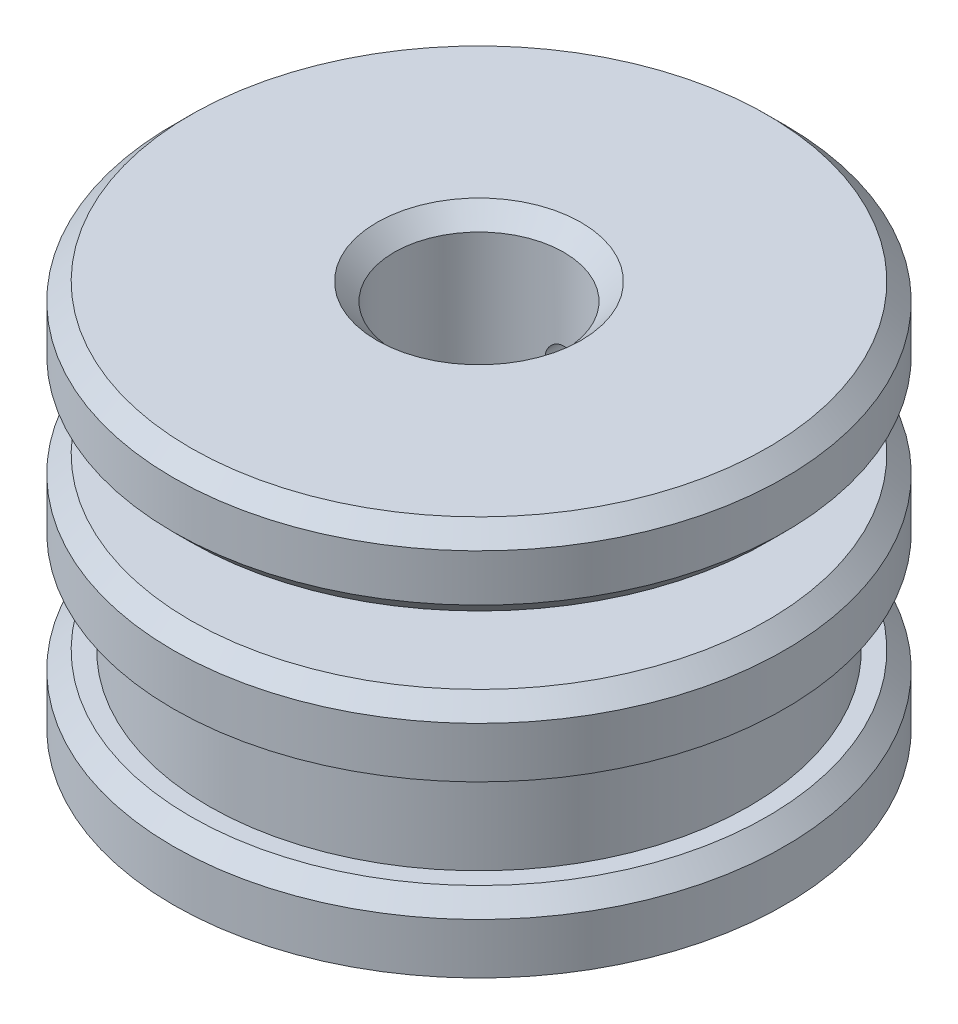
ISO-10303-21;
HEADER;
FILE_DESCRIPTION(('STEP AP214'),'2;1');
FILE_NAME('part.step','',(''),(''),'','','');
FILE_SCHEMA(('AUTOMOTIVE_DESIGN { 1 0 10303 214 1 1 1 1 }'));
ENDSEC;
DATA;
#1=APPLICATION_CONTEXT('core data for automotive mechanical design processes');
#2=APPLICATION_PROTOCOL_DEFINITION('international standard','automotive_design',2000,#1);
#3=PRODUCT_CONTEXT('',#1,'mechanical');
#4=PRODUCT('Part','Part','',(#3));
#5=PRODUCT_RELATED_PRODUCT_CATEGORY('part','',(#4));
#6=PRODUCT_DEFINITION_FORMATION('','',#4);
#7=PRODUCT_DEFINITION_CONTEXT('part definition',#1,'design');
#8=PRODUCT_DEFINITION('design','',#6,#7);
#9=PRODUCT_DEFINITION_SHAPE('','',#8);
#10=(LENGTH_UNIT() NAMED_UNIT(*) SI_UNIT(.MILLI.,.METRE.));
#11=(NAMED_UNIT(*) PLANE_ANGLE_UNIT() SI_UNIT($,.RADIAN.));
#12=(NAMED_UNIT(*) SI_UNIT($,.STERADIAN.) SOLID_ANGLE_UNIT());
#13=UNCERTAINTY_MEASURE_WITH_UNIT(LENGTH_MEASURE(1.E-05),#10,'distance_accuracy_value','');
#14=(GEOMETRIC_REPRESENTATION_CONTEXT(3) GLOBAL_UNCERTAINTY_ASSIGNED_CONTEXT((#13)) GLOBAL_UNIT_ASSIGNED_CONTEXT((#10,
#11,#12)) REPRESENTATION_CONTEXT('',''));
#15=CARTESIAN_POINT('',(0.,0.,0.));
#16=DIRECTION('',(0.,0.,1.));
#17=DIRECTION('',(1.,0.,0.));
#18=AXIS2_PLACEMENT_3D('',#15,#16,#17);
#19=CARTESIAN_POINT('',(0.,7.,0.));
#20=DIRECTION('',(0.,1.,0.));
#21=DIRECTION('',(0.,0.,1.));
#22=AXIS2_PLACEMENT_3D('',#19,#20,#21);
#23=PLANE('',#22);
#24=CARTESIAN_POINT('',(0.,7.,0.));
#25=DIRECTION('',(0.,1.,0.));
#26=DIRECTION('',(0.,0.,1.));
#27=AXIS2_PLACEMENT_3D('',#24,#25,#26);
#28=CIRCLE('',#27,8.492);
#29=CARTESIAN_POINT('',(0.,7.,8.492));
#30=VERTEX_POINT('',#29);
#31=EDGE_CURVE('E227',#30,#30,#28,.T.);
#32=ORIENTED_EDGE('',*,*,#31,.T.);
#33=EDGE_LOOP('',(#32));
#34=FACE_BOUND('',#33,.T.);
#35=CARTESIAN_POINT('',(0.,7.,0.));
#36=DIRECTION('',(0.,1.,0.));
#37=DIRECTION('',(0.,0.,1.));
#38=AXIS2_PLACEMENT_3D('',#35,#36,#37);
#39=CIRCLE('',#38,5.1);
#40=CARTESIAN_POINT('',(0.,7.,5.1));
#41=VERTEX_POINT('',#40);
#42=EDGE_CURVE('E64',#41,#41,#39,.T.);
#43=ORIENTED_EDGE('',*,*,#42,.F.);
#44=EDGE_LOOP('',(#43));
#45=FACE_BOUND('',#44,.T.);
#46=ADVANCED_FACE('F39',(#34,#45),#23,.T.);
#47=CARTESIAN_POINT('',(0.,3.5,0.));
#48=DIRECTION('',(0.,1.,0.));
#49=DIRECTION('',(0.,0.,1.));
#50=AXIS2_PLACEMENT_3D('',#47,#48,#49);
#51=PLANE('',#50);
#52=CARTESIAN_POINT('',(0.,3.5,0.));
#53=DIRECTION('',(0.,1.,0.));
#54=DIRECTION('',(0.,0.,1.));
#55=AXIS2_PLACEMENT_3D('',#52,#53,#54);
#56=CIRCLE('',#55,1.1375);
#57=CARTESIAN_POINT('',(0.,3.5,1.1375));
#58=VERTEX_POINT('',#57);
#59=EDGE_CURVE('E195',#58,#58,#56,.T.);
#60=ORIENTED_EDGE('',*,*,#59,.F.);
#61=EDGE_LOOP('',(#60));
#62=FACE_BOUND('',#61,.T.);
#63=CARTESIAN_POINT('',(0.,3.5,0.));
#64=DIRECTION('',(0.,1.,0.));
#65=DIRECTION('',(0.,0.,1.));
#66=AXIS2_PLACEMENT_3D('',#63,#64,#65);
#67=CIRCLE('',#66,2.5);
#68=CARTESIAN_POINT('',(0.,3.5,-2.5));
#69=VERTEX_POINT('',#68);
#70=EDGE_CURVE('E183',#69,#69,#67,.T.);
#71=ORIENTED_EDGE('',*,*,#70,.T.);
#72=EDGE_LOOP('',(#71));
#73=FACE_BOUND('',#72,.T.);
#74=ADVANCED_FACE('F123',(#62,#73),#51,.T.);
#75=CARTESIAN_POINT('',(0.,2.,0.));
#76=DIRECTION('',(0.,1.,0.));
#77=DIRECTION('',(0.,0.,1.));
#78=AXIS2_PLACEMENT_3D('',#75,#76,#77);
#79=PLANE('',#78);
#80=CARTESIAN_POINT('',(0.,2.,0.));
#81=DIRECTION('',(0.,1.,0.));
#82=DIRECTION('',(0.,0.,1.));
#83=AXIS2_PLACEMENT_3D('',#80,#81,#82);
#84=CIRCLE('',#83,8.492);
#85=CARTESIAN_POINT('',(0.,2.,8.492));
#86=VERTEX_POINT('',#85);
#87=EDGE_CURVE('E82',#86,#86,#84,.T.);
#88=ORIENTED_EDGE('',*,*,#87,.T.);
#89=EDGE_LOOP('',(#88));
#90=FACE_BOUND('',#89,.T.);
#91=CARTESIAN_POINT('',(0.,2.,0.));
#92=DIRECTION('',(0.,1.,0.));
#93=DIRECTION('',(0.,0.,1.));
#94=AXIS2_PLACEMENT_3D('',#91,#92,#93);
#95=CIRCLE('',#94,7.9615);
#96=CARTESIAN_POINT('',(0.,2.,7.9615));
#97=VERTEX_POINT('',#96);
#98=EDGE_CURVE('E203',#97,#97,#95,.T.);
#99=ORIENTED_EDGE('',*,*,#98,.F.);
#100=EDGE_LOOP('',(#99));
#101=FACE_BOUND('',#100,.T.);
#102=ADVANCED_FACE('F119',(#90,#101),#79,.T.);
#103=CARTESIAN_POINT('',(0.,0.,0.));
#104=DIRECTION('',(0.,1.,0.));
#105=DIRECTION('',(0.,0.,1.));
#106=AXIS2_PLACEMENT_3D('',#103,#104,#105);
#107=PLANE('',#106);
#108=CARTESIAN_POINT('',(0.,0.,0.));
#109=DIRECTION('',(0.,1.,0.));
#110=DIRECTION('',(0.,0.,1.));
#111=AXIS2_PLACEMENT_3D('',#108,#109,#110);
#112=CIRCLE('',#111,9.);
#113=CARTESIAN_POINT('',(0.,0.,9.));
#114=VERTEX_POINT('',#113);
#115=EDGE_CURVE('E207',#114,#114,#112,.T.);
#116=ORIENTED_EDGE('',*,*,#115,.F.);
#117=EDGE_LOOP('',(#116));
#118=FACE_BOUND('',#117,.T.);
#119=CARTESIAN_POINT('',(0.,0.,0.));
#120=DIRECTION('',(0.,1.,0.));
#121=DIRECTION('',(0.,0.,1.));
#122=AXIS2_PLACEMENT_3D('',#119,#120,#121);
#123=CIRCLE('',#122,2.35);
#124=CARTESIAN_POINT('',(0.,0.,2.35));
#125=VERTEX_POINT('',#124);
#126=EDGE_CURVE('E211',#125,#125,#123,.T.);
#127=ORIENTED_EDGE('',*,*,#126,.T.);
#128=EDGE_LOOP('',(#127));
#129=FACE_BOUND('',#128,.T.);
#130=ADVANCED_FACE('F122',(#118,#129),#107,.F.);
#131=CARTESIAN_POINT('',(0.,2.,0.));
#132=DIRECTION('',(0.,-1.,0.));
#133=DIRECTION('',(0.,0.,-1.));
#134=AXIS2_PLACEMENT_3D('',#131,#132,#133);
#135=CYLINDRICAL_SURFACE('',#134,9.);
#136=CARTESIAN_POINT('',(0.,1.492,0.));
#137=DIRECTION('',(0.,1.,0.));
#138=DIRECTION('',(0.,0.,1.));
#139=AXIS2_PLACEMENT_3D('',#136,#137,#138);
#140=CIRCLE('',#139,9.);
#141=CARTESIAN_POINT('',(0.,1.492,9.));
#142=VERTEX_POINT('',#141);
#143=EDGE_CURVE('E224',#142,#142,#140,.F.);
#144=ORIENTED_EDGE('',*,*,#143,.T.);
#145=EDGE_LOOP('',(#144));
#146=FACE_BOUND('',#145,.T.);
#147=ORIENTED_EDGE('',*,*,#115,.T.);
#148=EDGE_LOOP('',(#147));
#149=FACE_BOUND('',#148,.T.);
#150=ADVANCED_FACE('F117',(#146,#149),#135,.T.);
#151=CARTESIAN_POINT('',(0.,2.,0.));
#152=DIRECTION('',(0.,-1.,0.));
#153=DIRECTION('',(0.,0.,-1.));
#154=AXIS2_PLACEMENT_3D('',#151,#152,#153);
#155=CYLINDRICAL_SURFACE('',#154,2.35);
#156=CARTESIAN_POINT('',(0.,2.,0.));
#157=DIRECTION('',(0.,1.,0.));
#158=DIRECTION('',(0.,0.,1.));
#159=AXIS2_PLACEMENT_3D('',#156,#157,#158);
#160=CIRCLE('',#159,2.35);
#161=CARTESIAN_POINT('',(0.,2.,2.35));
#162=VERTEX_POINT('',#161);
#163=EDGE_CURVE('E199',#162,#162,#160,.T.);
#164=ORIENTED_EDGE('',*,*,#163,.T.);
#165=EDGE_LOOP('',(#164));
#166=FACE_BOUND('',#165,.T.);
#167=ORIENTED_EDGE('',*,*,#126,.F.);
#168=EDGE_LOOP('',(#167));
#169=FACE_BOUND('',#168,.T.);
#170=ADVANCED_FACE('F114',(#166,#169),#155,.F.);
#171=CARTESIAN_POINT('',(0.,2.,0.));
#172=DIRECTION('',(0.,1.,0.));
#173=DIRECTION('',(0.,0.,1.));
#174=AXIS2_PLACEMENT_3D('',#171,#172,#173);
#175=PLANE('',#174);
#176=ORIENTED_EDGE('',*,*,#163,.F.);
#177=EDGE_LOOP('',(#176));
#178=FACE_BOUND('',#177,.T.);
#179=CARTESIAN_POINT('',(0.,2.,0.));
#180=DIRECTION('',(0.,1.,0.));
#181=DIRECTION('',(0.,0.,1.));
#182=AXIS2_PLACEMENT_3D('',#179,#180,#181);
#183=CIRCLE('',#182,1.1375);
#184=CARTESIAN_POINT('',(0.,2.,1.1375));
#185=VERTEX_POINT('',#184);
#186=EDGE_CURVE('E194',#185,#185,#183,.T.);
#187=ORIENTED_EDGE('',*,*,#186,.T.);
#188=EDGE_LOOP('',(#187));
#189=FACE_BOUND('',#188,.T.);
#190=ADVANCED_FACE('F111',(#178,#189),#175,.F.);
#191=CARTESIAN_POINT('',(0.,3.5,0.));
#192=DIRECTION('',(0.,-1.,0.));
#193=DIRECTION('',(0.,0.,-1.));
#194=AXIS2_PLACEMENT_3D('',#191,#192,#193);
#195=CYLINDRICAL_SURFACE('',#194,7.9615);
#196=CARTESIAN_POINT('',(0.,4.5,-7.9615));
#197=CARTESIAN_POINT('',(-0.0280555522816665,4.49999876566125,-7.96149979131799));
#198=CARTESIAN_POINT('',(-0.0561307420873451,4.49763072306746,-7.96135011654607));
#199=CARTESIAN_POINT('',(-0.111505882549064,4.4882181320296,-7.96076742375952));
#200=CARTESIAN_POINT('',(-0.138804892611196,4.48116814235998,-7.9603340760767));
#201=CARTESIAN_POINT('',(-0.191817547783067,4.46259496482473,-7.9592330600608));
#202=CARTESIAN_POINT('',(-0.21753202164391,4.45107413872632,-7.95856551546257));
#203=CARTESIAN_POINT('',(-0.266655424655623,4.42389015587253,-7.95707118296904));
#204=CARTESIAN_POINT('',(-0.290064879701966,4.40822794700268,-7.95624443152497));
#205=CARTESIAN_POINT('',(-0.33395582006377,4.3731798642851,-7.95452321712793));
#206=CARTESIAN_POINT('',(-0.354433363504546,4.35378905795249,-7.95362866544382));
#207=CARTESIAN_POINT('',(-0.391845487729357,4.31184438186535,-7.95187342902687));
#208=CARTESIAN_POINT('',(-0.408779920373656,4.2892903799214,-7.95101274571132));
#209=CARTESIAN_POINT('',(-0.438637280957019,4.2416371927121,-7.94942162220577));
#210=CARTESIAN_POINT('',(-0.451556931121619,4.21653594987331,-7.94869128864271));
#211=CARTESIAN_POINT('',(-0.472997011695725,4.16451523674249,-7.94744437408186));
#212=CARTESIAN_POINT('',(-0.481517489792777,4.13759578616362,-7.946927790767));
#213=CARTESIAN_POINT('',(-0.493906412432775,4.08274080265692,-7.94616747761722));
#214=CARTESIAN_POINT('',(-0.497781036151258,4.05480667039121,-7.94592338538795));
#215=CARTESIAN_POINT('',(-0.500787338784039,3.99868352104073,-7.94573449546043));
#216=CARTESIAN_POINT('',(-0.499919071854149,3.97049450686994,-7.94578969434479));
#217=CARTESIAN_POINT('',(-0.493469367880923,3.91470388449016,-7.94619282541978));
#218=CARTESIAN_POINT('',(-0.487894618084738,3.88710149978029,-7.94654034226532));
#219=CARTESIAN_POINT('',(-0.472200567623059,3.83322505782507,-7.94748829227245));
#220=CARTESIAN_POINT('',(-0.462081239512402,3.80695100860274,-7.94808872696143));
#221=CARTESIAN_POINT('',(-0.437577692915494,3.75645558133197,-7.9494753255689));
#222=CARTESIAN_POINT('',(-0.423190441331208,3.73223567890446,-7.95026162149293));
#223=CARTESIAN_POINT('',(-0.39056164727838,3.68655219262267,-7.95193120022232));
#224=CARTESIAN_POINT('',(-0.372320061044963,3.66508864007041,-7.95281448412889));
#225=CARTESIAN_POINT('',(-0.332462747600807,3.62548821753974,-7.95458034313697));
#226=CARTESIAN_POINT('',(-0.310841233011267,3.6073571717986,-7.95546291436331));
#227=CARTESIAN_POINT('',(-0.264858106185197,3.57498136350542,-7.95712641833889));
#228=CARTESIAN_POINT('',(-0.240496492982663,3.56073660232347,-7.95790735105231));
#229=CARTESIAN_POINT('',(-0.189721170819998,3.53653821150247,-7.9592796416822));
#230=CARTESIAN_POINT('',(-0.163307356230161,3.52658480291831,-7.95987098983245));
#231=CARTESIAN_POINT('',(-0.109179003120587,3.51125555130128,-7.96079734362871));
#232=CARTESIAN_POINT('',(-0.0814644799425912,3.50587965429136,-7.96113235229741));
#233=CARTESIAN_POINT('',(-0.0255719562845861,3.49986524585095,-7.96150788744323));
#234=CARTESIAN_POINT('',(0.00260517448545931,3.4992186819885,-7.96154891446781));
#235=CARTESIAN_POINT('',(0.0586674914149309,3.50266025300309,-7.96133319463596));
#236=CARTESIAN_POINT('',(0.0865526791077887,3.50674836299866,-7.96107644934436));
#237=CARTESIAN_POINT('',(0.141216863159427,3.51953656774531,-7.96029440983043));
#238=CARTESIAN_POINT('',(0.167996727249672,3.52823296757338,-7.95976933076989));
#239=CARTESIAN_POINT('',(0.219716865036844,3.54998713985105,-7.95850969588825));
#240=CARTESIAN_POINT('',(0.244657122026531,3.56304495190488,-7.95777513816496));
#241=CARTESIAN_POINT('',(0.292026954623742,3.59317178013,-7.95617783415395));
#242=CARTESIAN_POINT('',(0.314453104348506,3.61024617376243,-7.95531491659057));
#243=CARTESIAN_POINT('',(0.356123637306743,3.64791365911845,-7.95355857696868));
#244=CARTESIAN_POINT('',(0.37536798891363,3.66850678581358,-7.95266515460707));
#245=CARTESIAN_POINT('',(0.410155930078497,3.71266191714444,-7.95094705067131));
#246=CARTESIAN_POINT('',(0.425694295173356,3.73622804224868,-7.95012246719309));
#247=CARTESIAN_POINT('',(0.452593447442267,3.78563950625768,-7.94863659262283));
#248=CARTESIAN_POINT('',(0.463954260580229,3.81148483099575,-7.94797530051593));
#249=CARTESIAN_POINT('',(0.482166772462599,3.86470196472342,-7.94689129187827));
#250=CARTESIAN_POINT('',(0.489021758382846,3.89207264505762,-7.94646840145636));
#251=CARTESIAN_POINT('',(0.498038763287107,3.94757921319753,-7.94590840403973));
#252=CARTESIAN_POINT('',(0.500200829387337,3.97571509331788,-7.9457712941758));
#253=CARTESIAN_POINT('',(0.499770165588161,4.0319014365658,-7.94579838944325));
#254=CARTESIAN_POINT('',(0.497185649350214,4.0599519632711,-7.94596207406902));
#255=CARTESIAN_POINT('',(0.487352215977729,4.11521992869653,-7.94657121023866));
#256=CARTESIAN_POINT('',(0.48010329040541,4.14243736590953,-7.94701666229224));
#257=CARTESIAN_POINT('',(0.461148659220582,4.19526778259293,-7.94813900751278));
#258=CARTESIAN_POINT('',(0.449442987719071,4.22088077434168,-7.94881589890835));
#259=CARTESIAN_POINT('',(0.42190827564331,4.26977896095069,-7.9503248318725));
#260=CARTESIAN_POINT('',(0.406079341346107,4.29306421578694,-7.95115686944203));
#261=CARTESIAN_POINT('',(0.370717064129016,4.3366875977128,-7.95288401149174));
#262=CARTESIAN_POINT('',(0.351177782415466,4.35702090655992,-7.95377921561284));
#263=CARTESIAN_POINT('',(0.308957451331552,4.39412586548483,-7.95553096656393));
#264=CARTESIAN_POINT('',(0.286275634553522,4.41089664304996,-7.95638750388352));
#265=CARTESIAN_POINT('',(0.238388042544736,4.44041295280263,-7.95796630096387));
#266=CARTESIAN_POINT('',(0.213179160569494,4.45315344826736,-7.95868839224498));
#267=CARTESIAN_POINT('',(0.160993877205899,4.47420545792264,-7.95991467286644));
#268=CARTESIAN_POINT('',(0.134019587221334,4.48252215800914,-7.96041911721676));
#269=CARTESIAN_POINT('',(0.0890669554035234,4.49232947252741,-7.96102110736195));
#270=CARTESIAN_POINT('',(0.0713791656914486,4.49520219953696,-7.96119989374308));
#271=CARTESIAN_POINT('',(0.0357969158030593,4.49903785575929,-7.96143940656038));
#272=CARTESIAN_POINT('',(0.0179024559155674,4.50000078764071,-7.96150013316154));
#273=CARTESIAN_POINT('',(0.,4.5,-7.9615));
#274=B_SPLINE_CURVE_WITH_KNOTS('',3,(#196,#197,#198,#199,#200,#201,#202,#203,#204,#205,#206,
#207,#208,#209,#210,#211,#212,#213,#214,#215,#216,#217,#218,#219,#220,#221,#222,#223,#224,#225,
#226,#227,#228,#229,#230,#231,#232,#233,#234,#235,#236,#237,#238,#239,#240,#241,#242,#243,#244,
#245,#246,#247,#248,#249,#250,#251,#252,#253,#254,#255,#256,#257,#258,#259,#260,#261,#262,#263,
#264,#265,#266,#267,#268,#269,#270,#271,#272,#273),.UNSPECIFIED.,.T.,.F.,(4,2,2,2,2,2,2,2,2,2,2,
2,2,2,2,2,2,2,2,2,2,2,2,2,2,2,2,2,2,2,2,2,2,2,2,2,2,2,4),(0.,0.0841013021374013,
0.168300515856559,0.252455310854731,0.336590861032201,0.420838487792085,0.505089636295716,
0.589409390034468,0.673728229717928,0.757934797067744,0.842140402922581,0.926226565477785,
1.01031323584457,1.09445980808805,1.1786073358433,1.262900558528,1.34719381092983,
1.43149140490253,1.51578800484243,1.59994104310795,1.68409363913746,1.76817886355132,
1.85226485152992,1.9364640623364,2.02066411001982,2.10498216508614,2.18929969609829,
2.27355564572423,2.35781074942908,2.44192019234253,2.52602978740794,2.61013873872909,
2.69424552235752,2.77848807994574,2.86275124596161,2.94711930505771,3.03138824256247,
3.08505398197475,3.13871964639799),.UNSPECIFIED.);
#275=CARTESIAN_POINT('',(0.,4.5,-7.9615));
#276=VERTEX_POINT('',#275);
#277=EDGE_CURVE('E58',#276,#276,#274,.T.);
#278=ORIENTED_EDGE('',*,*,#277,.T.);
#279=EDGE_LOOP('',(#278));
#280=FACE_BOUND('',#279,.T.);
#281=ORIENTED_EDGE('',*,*,#98,.T.);
#282=EDGE_LOOP('',(#281));
#283=FACE_BOUND('',#282,.T.);
#284=CARTESIAN_POINT('',(0.,5.,0.));
#285=DIRECTION('',(0.,1.,0.));
#286=DIRECTION('',(0.,0.,1.));
#287=AXIS2_PLACEMENT_3D('',#284,#285,#286);
#288=CIRCLE('',#287,7.9615);
#289=CARTESIAN_POINT('',(0.,5.,7.9615));
#290=VERTEX_POINT('',#289);
#291=EDGE_CURVE('E187',#290,#290,#288,.T.);
#292=ORIENTED_EDGE('',*,*,#291,.F.);
#293=EDGE_LOOP('',(#292));
#294=FACE_BOUND('',#293,.T.);
#295=ADVANCED_FACE('F105',(#280,#283,#294),#195,.T.);
#296=CARTESIAN_POINT('',(0.,3.5,0.));
#297=DIRECTION('',(0.,-1.,0.));
#298=DIRECTION('',(0.,0.,-1.));
#299=AXIS2_PLACEMENT_3D('',#296,#297,#298);
#300=CYLINDRICAL_SURFACE('',#299,1.1375);
#301=ORIENTED_EDGE('',*,*,#59,.T.);
#302=EDGE_LOOP('',(#301));
#303=FACE_BOUND('',#302,.T.);
#304=ORIENTED_EDGE('',*,*,#186,.F.);
#305=EDGE_LOOP('',(#304));
#306=FACE_BOUND('',#305,.T.);
#307=ADVANCED_FACE('F110',(#303,#306),#300,.F.);
#308=CARTESIAN_POINT('',(0.,5.,0.));
#309=DIRECTION('',(0.,-1.,0.));
#310=DIRECTION('',(0.,0.,-1.));
#311=AXIS2_PLACEMENT_3D('',#308,#309,#310);
#312=CYLINDRICAL_SURFACE('',#311,2.5);
#313=CARTESIAN_POINT('',(0.,10.892,0.));
#314=DIRECTION('',(0.,1.,0.));
#315=DIRECTION('',(0.,0.,1.));
#316=AXIS2_PLACEMENT_3D('',#313,#314,#315);
#317=CIRCLE('',#316,2.5);
#318=CARTESIAN_POINT('',(0.,10.892,2.5));
#319=VERTEX_POINT('',#318);
#320=EDGE_CURVE('E11',#319,#319,#317,.T.);
#321=ORIENTED_EDGE('',*,*,#320,.T.);
#322=EDGE_LOOP('',(#321));
#323=FACE_BOUND('',#322,.T.);
#324=CARTESIAN_POINT('',(0.,8.5,-2.5));
#325=CARTESIAN_POINT('',(-0.0277884533963166,8.49999897775083,-2.49999948790436));
#326=CARTESIAN_POINT('',(-0.0555898301007612,8.49767557851618,-2.49953192589115));
#327=CARTESIAN_POINT('',(-0.11040675384451,8.48845074994238,-2.49771182811616));
#328=CARTESIAN_POINT('',(-0.137421658770678,8.48154568359925,-2.49635858930093));
#329=CARTESIAN_POINT('',(-0.189865152631656,8.4633793631896,-2.49291824639143));
#330=CARTESIAN_POINT('',(-0.215295233966567,8.45212228157766,-2.49083184538359));
#331=CARTESIAN_POINT('',(-0.263903994432113,8.42558387624435,-2.48615199017657));
#332=CARTESIAN_POINT('',(-0.287082807537906,8.4103027921964,-2.48355856617854));
#333=CARTESIAN_POINT('',(-0.330846738657433,8.37593075285428,-2.47811082664985));
#334=CARTESIAN_POINT('',(-0.351396975579263,8.3567958223044,-2.47525372752174));
#335=CARTESIAN_POINT('',(-0.389018378304015,8.31535379180415,-2.46962090226294));
#336=CARTESIAN_POINT('',(-0.406089272385213,8.29304644433244,-2.46684518250212));
#337=CARTESIAN_POINT('',(-0.436415876673811,8.24564190349406,-2.46166220906308));
#338=CARTESIAN_POINT('',(-0.449635469432934,8.22052117810182,-2.45925853682473));
#339=CARTESIAN_POINT('',(-0.471652833290155,8.16835909049796,-2.45513134029209));
#340=CARTESIAN_POINT('',(-0.48045104121862,8.14131791832683,-2.45340774880981));
#341=CARTESIAN_POINT('',(-0.493262649942414,8.08645781804604,-2.45086402626102));
#342=CARTESIAN_POINT('',(-0.497337248979389,8.05865372792889,-2.45003235053594));
#343=CARTESIAN_POINT('',(-0.50077606386306,8.00274508931783,-2.44933187530314));
#344=CARTESIAN_POINT('',(-0.500140761356751,7.97464057183993,-2.4494629773392));
#345=CARTESIAN_POINT('',(-0.49422728655091,7.9193766059895,-2.45066275574092));
#346=CARTESIAN_POINT('',(-0.489019270121953,7.89220929718634,-2.45171726429382));
#347=CARTESIAN_POINT('',(-0.474218942311526,7.8391419616685,-2.45462273080001));
#348=CARTESIAN_POINT('',(-0.464626421550341,7.8132419955405,-2.45647372678889));
#349=CARTESIAN_POINT('',(-0.44126239183736,7.7632423691482,-2.46077809250204));
#350=CARTESIAN_POINT('',(-0.427463075616058,7.73915606021541,-2.46323544906852));
#351=CARTESIAN_POINT('',(-0.39609678728634,7.69361457501359,-2.46847309386531));
#352=CARTESIAN_POINT('',(-0.378529382178415,7.67215970157442,-2.47125341919183));
#353=CARTESIAN_POINT('',(-0.339749967280292,7.63208529877153,-2.47688510620731));
#354=CARTESIAN_POINT('',(-0.318478080606222,7.61352371607043,-2.47973684605452));
#355=CARTESIAN_POINT('',(-0.273092512031005,7.58022307684939,-2.48514424357204));
#356=CARTESIAN_POINT('',(-0.248978793689695,7.56548406935321,-2.48769989744487));
#357=CARTESIAN_POINT('',(-0.198529693439461,7.54023624538701,-2.49223345080444));
#358=CARTESIAN_POINT('',(-0.17219090979265,7.52973405317773,-2.49421044424136));
#359=CARTESIAN_POINT('',(-0.118074488224332,7.51331976298072,-2.49735704493929));
#360=CARTESIAN_POINT('',(-0.0902970250362247,7.50740710896319,-2.49852675000266));
#361=CARTESIAN_POINT('',(-0.034589702813575,7.50042177310286,-2.49991335933434));
#362=CARTESIAN_POINT('',(-0.00667016416278788,7.49926979022987,-2.50014587326235));
#363=CARTESIAN_POINT('',(0.0489624670963572,7.50162492947109,-2.49967525965051));
#364=CARTESIAN_POINT('',(0.0766755712218968,7.5051317896763,-2.49897218470723));
#365=CARTESIAN_POINT('',(0.130852829973271,7.51663918677198,-2.49671916004009));
#366=CARTESIAN_POINT('',(0.157325974169952,7.52459903424895,-2.49517688202103));
#367=CARTESIAN_POINT('',(0.208561813749834,7.5447419913279,-2.49141776030516));
#368=CARTESIAN_POINT('',(0.23332438081877,7.55692541733842,-2.48920086607113));
#369=CARTESIAN_POINT('',(0.280770586843109,7.58534124532566,-2.48429955766647));
#370=CARTESIAN_POINT('',(0.303425063376095,7.60162139051947,-2.48160975218526));
#371=CARTESIAN_POINT('',(0.345709009559604,7.63770459560364,-2.47607367414941));
#372=CARTESIAN_POINT('',(0.365338154465382,7.65750803319993,-2.47322738484194));
#373=CARTESIAN_POINT('',(0.401320295387089,7.70043667594556,-2.46764651778482));
#374=CARTESIAN_POINT('',(0.417618851224329,7.72360787211067,-2.46491430116652));
#375=CARTESIAN_POINT('',(0.446092710025604,7.77240568067834,-2.45992095898097));
#376=CARTESIAN_POINT('',(0.458268177961452,7.79803219478678,-2.45765981456671));
#377=CARTESIAN_POINT('',(0.478075920790981,7.85088412307478,-2.45388370292191));
#378=CARTESIAN_POINT('',(0.485731749895526,7.87810042060516,-2.45236487436093));
#379=CARTESIAN_POINT('',(0.496354325813599,7.93346672674545,-2.45023718396013));
#380=CARTESIAN_POINT('',(0.499321684112557,7.96161661310468,-2.44962820345556));
#381=CARTESIAN_POINT('',(0.500460455433734,8.01750443227216,-2.4493957481569));
#382=CARTESIAN_POINT('',(0.498717894035448,8.04524057446351,-2.4497545959465));
#383=CARTESIAN_POINT('',(0.49067615205003,8.10001582495252,-2.45137786742307));
#384=CARTESIAN_POINT('',(0.484377008064649,8.1270549388474,-2.45264228383585));
#385=CARTESIAN_POINT('',(0.467439284249477,8.17961385562027,-2.45592632109579));
#386=CARTESIAN_POINT('',(0.456811253358672,8.20513718025121,-2.45794410509415));
#387=CARTESIAN_POINT('',(0.431527322300801,8.25405186036722,-2.46250857487085));
#388=CARTESIAN_POINT('',(0.416871084387441,8.27744303686257,-2.46505530499447));
#389=CARTESIAN_POINT('',(0.383652957393207,8.32185778607516,-2.47044480261613));
#390=CARTESIAN_POINT('',(0.36502894361759,8.3428343826338,-2.4732918645485));
#391=CARTESIAN_POINT('',(0.32453218450657,8.38139310276459,-2.47893040935977));
#392=CARTESIAN_POINT('',(0.302658693576667,8.39897444515864,-2.48172187931592));
#393=CARTESIAN_POINT('',(0.256008814544123,8.43041732197323,-2.48696916193986));
#394=CARTESIAN_POINT('',(0.231204442214917,8.44423800164001,-2.48942115609623));
#395=CARTESIAN_POINT('',(0.179583180470366,8.4674930612983,-2.493675625425));
#396=CARTESIAN_POINT('',(0.152768130431563,8.47693139476625,-2.49547868569308));
#397=CARTESIAN_POINT('',(0.10491074446189,8.48932597402236,-2.49788186297685));
#398=CARTESIAN_POINT('',(0.0841408320068922,8.49332159685388,-2.49867151579226));
#399=CARTESIAN_POINT('',(0.0422497626050334,8.49865895617918,-2.49973077069946));
#400=CARTESIAN_POINT('',(0.0211286168743095,8.50000077725488,-2.50000038936577));
#401=CARTESIAN_POINT('',(0.,8.5,-2.5));
#402=B_SPLINE_CURVE_WITH_KNOTS('',3,(#324,#325,#326,#327,#328,#329,#330,#331,#332,#333,#334,
#335,#336,#337,#338,#339,#340,#341,#342,#343,#344,#345,#346,#347,#348,#349,#350,#351,#352,#353,
#354,#355,#356,#357,#358,#359,#360,#361,#362,#363,#364,#365,#366,#367,#368,#369,#370,#371,#372,
#373,#374,#375,#376,#377,#378,#379,#380,#381,#382,#383,#384,#385,#386,#387,#388,#389,#390,#391,
#392,#393,#394,#395,#396,#397,#398,#399,#400,#401),.UNSPECIFIED.,.T.,.F.,(4,2,2,2,2,2,2,2,2,2,2,
2,2,2,2,2,2,2,2,2,2,2,2,2,2,2,2,2,2,2,2,2,2,2,2,2,2,2,4),(0.,0.0832880653306292,
0.166642325345662,0.249916867625171,0.333186451115432,0.417466335056093,0.501752798373684,
0.586805975029615,0.671850746825989,0.755780925517938,0.839702521406128,0.922358635031393,
1.00501869626865,1.08823745101796,1.17146577374835,1.25619126245676,1.3409178376991,
1.42577637427012,1.51062462849018,1.59405367838133,1.67747803828934,1.76015226975362,
1.84283269608011,1.9265253301668,2.01022694172965,2.09520314289613,2.18017594361734,
2.26470190516362,2.34921684165208,2.43219861283851,2.51517971746305,2.59795980626556,
2.68074683790934,2.76494038119572,2.84915327266466,2.93424748337819,3.0192647775876,
3.08259387644947,3.14592095685498),.UNSPECIFIED.);
#403=CARTESIAN_POINT('',(0.,8.5,-2.5));
#404=VERTEX_POINT('',#403);
#405=EDGE_CURVE('E59',#404,#404,#402,.T.);
#406=ORIENTED_EDGE('',*,*,#405,.F.);
#407=EDGE_LOOP('',(#406));
#408=FACE_BOUND('',#407,.T.);
#409=ORIENTED_EDGE('',*,*,#70,.F.);
#410=CARTESIAN_POINT('',(0.,4.5,-2.5));
#411=CARTESIAN_POINT('',(-0.0277884533963166,4.49999897775083,-2.49999948790436));
#412=CARTESIAN_POINT('',(-0.0555898301007611,4.49767557851618,-2.49953192589115));
#413=CARTESIAN_POINT('',(-0.11040675384451,4.48845074994238,-2.49771182811616));
#414=CARTESIAN_POINT('',(-0.137421658770678,4.48154568359925,-2.49635858930093));
#415=CARTESIAN_POINT('',(-0.189865152631657,4.46337936318961,-2.49291824639143));
#416=CARTESIAN_POINT('',(-0.215295233966567,4.45212228157766,-2.49083184538359));
#417=CARTESIAN_POINT('',(-0.263903994432113,4.42558387624435,-2.48615199017657));
#418=CARTESIAN_POINT('',(-0.287082807537906,4.4103027921964,-2.48355856617854));
#419=CARTESIAN_POINT('',(-0.330846738657432,4.37593075285428,-2.47811082664985));
#420=CARTESIAN_POINT('',(-0.351396975579262,4.3567958223044,-2.47525372752174));
#421=CARTESIAN_POINT('',(-0.389018378304014,4.31535379180415,-2.46962090226294));
#422=CARTESIAN_POINT('',(-0.406089272385212,4.29304644433244,-2.46684518250212));
#423=CARTESIAN_POINT('',(-0.43641587667381,4.24564190349406,-2.46166220906308));
#424=CARTESIAN_POINT('',(-0.449635469432933,4.22052117810182,-2.45925853682473));
#425=CARTESIAN_POINT('',(-0.471652833290154,4.16835909049796,-2.45513134029209));
#426=CARTESIAN_POINT('',(-0.480451041218619,4.14131791832683,-2.45340774880981));
#427=CARTESIAN_POINT('',(-0.493262649942414,4.08645781804604,-2.45086402626102));
#428=CARTESIAN_POINT('',(-0.497337248979389,4.05865372792889,-2.45003235053594));
#429=CARTESIAN_POINT('',(-0.50077606386306,4.00274508931783,-2.44933187530314));
#430=CARTESIAN_POINT('',(-0.50014076135675,3.97464057183993,-2.4494629773392));
#431=CARTESIAN_POINT('',(-0.494227286550909,3.9193766059895,-2.45066275574092));
#432=CARTESIAN_POINT('',(-0.489019270121953,3.89220929718634,-2.45171726429382));
#433=CARTESIAN_POINT('',(-0.474218942311525,3.8391419616685,-2.45462273080001));
#434=CARTESIAN_POINT('',(-0.46462642155034,3.8132419955405,-2.45647372678889));
#435=CARTESIAN_POINT('',(-0.44126239183736,3.7632423691482,-2.46077809250204));
#436=CARTESIAN_POINT('',(-0.427463075616057,3.73915606021541,-2.46323544906852));
#437=CARTESIAN_POINT('',(-0.396096787286339,3.69361457501359,-2.46847309386531));
#438=CARTESIAN_POINT('',(-0.378529382178414,3.67215970157442,-2.47125341919183));
#439=CARTESIAN_POINT('',(-0.339749967280292,3.63208529877153,-2.47688510620731));
#440=CARTESIAN_POINT('',(-0.318478080606222,3.61352371607043,-2.47973684605452));
#441=CARTESIAN_POINT('',(-0.273092512031005,3.58022307684939,-2.48514424357204));
#442=CARTESIAN_POINT('',(-0.248978793689694,3.56548406935321,-2.48769989744487));
#443=CARTESIAN_POINT('',(-0.19852969343946,3.54023624538701,-2.49223345080444));
#444=CARTESIAN_POINT('',(-0.17219090979265,3.52973405317773,-2.49421044424136));
#445=CARTESIAN_POINT('',(-0.118074488224332,3.51331976298072,-2.49735704493929));
#446=CARTESIAN_POINT('',(-0.0902970250362245,3.50740710896319,-2.49852675000266));
#447=CARTESIAN_POINT('',(-0.0345897028135748,3.50042177310286,-2.49991335933434));
#448=CARTESIAN_POINT('',(-0.00667016416278772,3.49926979022987,-2.50014587326235));
#449=CARTESIAN_POINT('',(0.0489624670963573,3.50162492947109,-2.49967525965051));
#450=CARTESIAN_POINT('',(0.0766755712218968,3.5051317896763,-2.49897218470723));
#451=CARTESIAN_POINT('',(0.130852829973271,3.51663918677198,-2.49671916004009));
#452=CARTESIAN_POINT('',(0.157325974169952,3.52459903424895,-2.49517688202103));
#453=CARTESIAN_POINT('',(0.208561813749834,3.5447419913279,-2.49141776030516));
#454=CARTESIAN_POINT('',(0.23332438081877,3.55692541733842,-2.48920086607113));
#455=CARTESIAN_POINT('',(0.280770586843109,3.58534124532566,-2.48429955766647));
#456=CARTESIAN_POINT('',(0.303425063376094,3.60162139051947,-2.48160975218526));
#457=CARTESIAN_POINT('',(0.345709009559603,3.63770459560364,-2.47607367414941));
#458=CARTESIAN_POINT('',(0.365338154465381,3.65750803319993,-2.47322738484194));
#459=CARTESIAN_POINT('',(0.401320295387088,3.70043667594556,-2.46764651778483));
#460=CARTESIAN_POINT('',(0.417618851224327,3.72360787211067,-2.46491430116652));
#461=CARTESIAN_POINT('',(0.446092710025603,3.77240568067834,-2.45992095898097));
#462=CARTESIAN_POINT('',(0.458268177961451,3.79803219478678,-2.45765981456671));
#463=CARTESIAN_POINT('',(0.47807592079098,3.85088412307477,-2.45388370292191));
#464=CARTESIAN_POINT('',(0.485731749895525,3.87810042060516,-2.45236487436093));
#465=CARTESIAN_POINT('',(0.496354325813598,3.93346672674545,-2.45023718396013));
#466=CARTESIAN_POINT('',(0.499321684112556,3.96161661310467,-2.44962820345556));
#467=CARTESIAN_POINT('',(0.500460455433734,4.01750443227216,-2.4493957481569));
#468=CARTESIAN_POINT('',(0.498717894035448,4.0452405744635,-2.4497545959465));
#469=CARTESIAN_POINT('',(0.490676152050031,4.10001582495251,-2.45137786742307));
#470=CARTESIAN_POINT('',(0.484377008064649,4.1270549388474,-2.45264228383585));
#471=CARTESIAN_POINT('',(0.467439284249477,4.17961385562027,-2.45592632109579));
#472=CARTESIAN_POINT('',(0.456811253358672,4.20513718025121,-2.45794410509415));
#473=CARTESIAN_POINT('',(0.431527322300802,4.25405186036722,-2.46250857487085));
#474=CARTESIAN_POINT('',(0.416871084387441,4.27744303686257,-2.46505530499447));
#475=CARTESIAN_POINT('',(0.383652957393207,4.32185778607516,-2.47044480261613));
#476=CARTESIAN_POINT('',(0.36502894361759,4.3428343826338,-2.4732918645485));
#477=CARTESIAN_POINT('',(0.324532184506571,4.38139310276459,-2.47893040935977));
#478=CARTESIAN_POINT('',(0.302658693576668,4.39897444515864,-2.48172187931592));
#479=CARTESIAN_POINT('',(0.256008814544123,4.43041732197322,-2.48696916193986));
#480=CARTESIAN_POINT('',(0.231204442214918,4.44423800164001,-2.48942115609623));
#481=CARTESIAN_POINT('',(0.179583180470367,4.4674930612983,-2.493675625425));
#482=CARTESIAN_POINT('',(0.152768130431563,4.47693139476625,-2.49547868569308));
#483=CARTESIAN_POINT('',(0.10491074446189,4.48932597402236,-2.49788186297685));
#484=CARTESIAN_POINT('',(0.0841408320068926,4.49332159685388,-2.49867151579226));
#485=CARTESIAN_POINT('',(0.0422497626050337,4.49865895617918,-2.49973077069946));
#486=CARTESIAN_POINT('',(0.0211286168743096,4.50000077725488,-2.50000038936577));
#487=CARTESIAN_POINT('',(0.,4.5,-2.5));
#488=B_SPLINE_CURVE_WITH_KNOTS('',3,(#410,#411,#412,#413,#414,#415,#416,#417,#418,#419,#420,
#421,#422,#423,#424,#425,#426,#427,#428,#429,#430,#431,#432,#433,#434,#435,#436,#437,#438,#439,
#440,#441,#442,#443,#444,#445,#446,#447,#448,#449,#450,#451,#452,#453,#454,#455,#456,#457,#458,
#459,#460,#461,#462,#463,#464,#465,#466,#467,#468,#469,#470,#471,#472,#473,#474,#475,#476,#477,
#478,#479,#480,#481,#482,#483,#484,#485,#486,#487),.UNSPECIFIED.,.T.,.F.,(4,2,2,2,2,2,2,2,2,2,2,
2,2,2,2,2,2,2,2,2,2,2,2,2,2,2,2,2,2,2,2,2,2,2,2,2,2,2,4),(0.,0.0832880653306292,
0.166642325345662,0.249916867625171,0.333186451115432,0.417466335056093,0.501752798373683,
0.586805975029613,0.671850746825988,0.755780925517937,0.839702521406126,0.922358635031392,
1.00501869626865,1.08823745101796,1.17146577374835,1.25619126245675,1.3409178376991,
1.42577637427012,1.51062462849018,1.59405367838133,1.67747803828934,1.76015226975362,
1.84283269608011,1.92652533016679,2.01022694172965,2.09520314289613,2.18017594361733,
2.26470190516362,2.34921684165207,2.43219861283851,2.51517971746304,2.59795980626555,
2.68074683790933,2.76494038119572,2.84915327266465,2.93424748337819,3.01926477758759,
3.08259387644947,3.14592095685498),.UNSPECIFIED.);
#489=EDGE_CURVE('E51',#69,#69,#488,.T.);
#490=ORIENTED_EDGE('',*,*,#489,.F.);
#491=EDGE_LOOP('',(#409,#490));
#492=FACE_BOUND('',#491,.T.);
#493=ADVANCED_FACE('F84',(#323,#408,#492),#312,.F.);
#494=CARTESIAN_POINT('',(0.,5.,0.));
#495=DIRECTION('',(0.,1.,0.));
#496=DIRECTION('',(0.,0.,1.));
#497=AXIS2_PLACEMENT_3D('',#494,#495,#496);
#498=PLANE('',#497);
#499=ORIENTED_EDGE('',*,*,#291,.T.);
#500=EDGE_LOOP('',(#499));
#501=FACE_BOUND('',#500,.T.);
#502=CARTESIAN_POINT('',(0.,5.,0.));
#503=DIRECTION('',(0.,1.,0.));
#504=DIRECTION('',(0.,0.,1.));
#505=AXIS2_PLACEMENT_3D('',#502,#503,#504);
#506=CIRCLE('',#505,9.);
#507=CARTESIAN_POINT('',(0.,5.,9.));
#508=VERTEX_POINT('',#507);
#509=EDGE_CURVE('E180',#508,#508,#506,.T.);
#510=ORIENTED_EDGE('',*,*,#509,.F.);
#511=EDGE_LOOP('',(#510));
#512=FACE_BOUND('',#511,.T.);
#513=ADVANCED_FACE('F163',(#501,#512),#498,.F.);
#514=CARTESIAN_POINT('',(0.,7.,0.));
#515=DIRECTION('',(0.,-1.,0.));
#516=DIRECTION('',(0.,0.,-1.));
#517=AXIS2_PLACEMENT_3D('',#514,#515,#516);
#518=CYLINDRICAL_SURFACE('',#517,9.);
#519=CARTESIAN_POINT('',(0.,6.492,0.));
#520=DIRECTION('',(0.,1.,0.));
#521=DIRECTION('',(0.,0.,1.));
#522=AXIS2_PLACEMENT_3D('',#519,#520,#521);
#523=CIRCLE('',#522,9.);
#524=CARTESIAN_POINT('',(0.,6.492,9.));
#525=VERTEX_POINT('',#524);
#526=EDGE_CURVE('E177',#525,#525,#523,.F.);
#527=ORIENTED_EDGE('',*,*,#526,.T.);
#528=EDGE_LOOP('',(#527));
#529=FACE_BOUND('',#528,.T.);
#530=ORIENTED_EDGE('',*,*,#509,.T.);
#531=EDGE_LOOP('',(#530));
#532=FACE_BOUND('',#531,.T.);
#533=ADVANCED_FACE('F165',(#529,#532),#518,.T.);
#534=CARTESIAN_POINT('',(0.,9.,0.));
#535=DIRECTION('',(0.,-1.,0.));
#536=DIRECTION('',(0.,0.,-1.));
#537=AXIS2_PLACEMENT_3D('',#534,#535,#536);
#538=CYLINDRICAL_SURFACE('',#537,5.1);
#539=CARTESIAN_POINT('',(0.,8.5,-5.1));
#540=CARTESIAN_POINT('',(-0.0280130800732408,8.49999878551635,-5.09999968326944));
#541=CARTESIAN_POINT('',(-0.056044750772727,8.49763787685404,-5.0997667427731));
#542=CARTESIAN_POINT('',(-0.11133114405438,8.48825527790231,-5.09885989588053));
#543=CARTESIAN_POINT('',(-0.138584972787728,8.48122843426212,-5.09818550192718));
#544=CARTESIAN_POINT('',(-0.191507060928396,8.46272031960364,-5.09647188561499));
#545=CARTESIAN_POINT('',(-0.217176259625655,8.45124171733315,-5.0954328818685));
#546=CARTESIAN_POINT('',(-0.266217983266873,8.42416105048723,-5.09310626786277));
#547=CARTESIAN_POINT('',(-0.289590967997423,8.40855981373301,-5.09181870752744));
#548=CARTESIAN_POINT('',(-0.333463458980569,8.37361867495773,-5.0891342533082));
#549=CARTESIAN_POINT('',(-0.353953893031316,8.35426740565086,-5.0877370348858));
#550=CARTESIAN_POINT('',(-0.39140167608764,8.31239973437247,-5.08499342829409));
#551=CARTESIAN_POINT('',(-0.408358862746318,8.28988318704119,-5.08364704246279));
#552=CARTESIAN_POINT('',(-0.438290762677336,8.24226755746953,-5.08115420577679));
#553=CARTESIAN_POINT('',(-0.451257294257253,8.21716330862978,-5.08000816772724));
#554=CARTESIAN_POINT('',(-0.472787566696424,8.1651207414525,-5.07804977146062));
#555=CARTESIAN_POINT('',(-0.481351412371321,8.13818246679529,-5.07723740529984));
#556=CARTESIAN_POINT('',(-0.493806389486838,8.08332886424897,-5.07604124049766));
#557=CARTESIAN_POINT('',(-0.497712537012832,8.05541697641846,-5.07565606490662));
#558=CARTESIAN_POINT('',(-0.500787650551477,7.99933131520684,-5.07535360787744));
#559=CARTESIAN_POINT('',(-0.499956736542996,7.97115754847656,-5.07543631458892));
#560=CARTESIAN_POINT('',(-0.493593694496101,7.91545131302753,-5.07605902072832));
#561=CARTESIAN_POINT('',(-0.488077952316436,7.88791695231481,-5.07659742626131));
#562=CARTESIAN_POINT('',(-0.472527316667209,7.83416666241498,-5.07806837416577));
#563=CARTESIAN_POINT('',(-0.462492364285352,7.80795075042008,-5.07900092167527));
#564=CARTESIAN_POINT('',(-0.438170043959456,7.75752971176038,-5.08115691293724));
#565=CARTESIAN_POINT('',(-0.42387539579114,7.73332811909,-5.082380853983));
#566=CARTESIAN_POINT('',(-0.391444690000398,7.68766138212132,-5.08498129941449));
#567=CARTESIAN_POINT('',(-0.373308524337574,7.66619631481336,-5.08635780809058));
#568=CARTESIAN_POINT('',(-0.333618034879317,7.62651671817543,-5.08911539166581));
#569=CARTESIAN_POINT('',(-0.312049558018064,7.60831634242251,-5.0904964612096));
#570=CARTESIAN_POINT('',(-0.266155870531834,7.57579243787019,-5.09310204240144));
#571=CARTESIAN_POINT('',(-0.241830656995252,7.56146891316549,-5.09432655388413));
#572=CARTESIAN_POINT('',(-0.191104270522167,7.53710591049047,-5.09648142921039));
#573=CARTESIAN_POINT('',(-0.164702756064242,7.52706713905272,-5.09741174453607));
#574=CARTESIAN_POINT('',(-0.11057778257235,7.5115689209896,-5.09887290356887));
#575=CARTESIAN_POINT('',(-0.0828543615556376,7.50610934275318,-5.09940375875686));
#576=CARTESIAN_POINT('',(-0.0269951257607748,7.49994241738262,-5.10000470961873));
#577=CARTESIAN_POINT('',(0.00113851299571981,7.49921553695252,-5.10007669914606));
#578=CARTESIAN_POINT('',(0.0571272180997315,7.50248335387233,-5.09975688305431));
#579=CARTESIAN_POINT('',(0.0849822880574251,7.50647798995248,-5.0993650834537));
#580=CARTESIAN_POINT('',(0.139566860321746,7.51905924374305,-5.09816293470077));
#581=CARTESIAN_POINT('',(0.1662984878794,7.52763672720488,-5.09735341822538));
#582=CARTESIAN_POINT('',(0.217943395094837,7.54913081270162,-5.09540666801051));
#583=CARTESIAN_POINT('',(0.242856635473644,7.56204750843409,-5.09426942719449));
#584=CARTESIAN_POINT('',(0.29024596229035,7.59190188526759,-5.09178975344027));
#585=CARTESIAN_POINT('',(0.312713920661505,7.6088524135459,-5.09044666989003));
#586=CARTESIAN_POINT('',(0.354492653371568,7.64627485398984,-5.08770814265116));
#587=CARTESIAN_POINT('',(0.373803351571123,7.66674685105352,-5.0863126977008));
#588=CARTESIAN_POINT('',(0.408787122212984,7.71071627493695,-5.08362103661198));
#589=CARTESIAN_POINT('',(0.424447384161978,7.73422391940635,-5.0823251803125));
#590=CARTESIAN_POINT('',(0.451597708653259,7.78354688679138,-5.07998484232673));
#591=CARTESIAN_POINT('',(0.463087826301856,7.80936217920701,-5.07894035731876));
#592=CARTESIAN_POINT('',(0.481550206216951,7.86252352687239,-5.07722323853239));
#593=CARTESIAN_POINT('',(0.488530118594099,7.88986690414837,-5.07654997538182));
#594=CARTESIAN_POINT('',(0.497798786579692,7.94534447117948,-5.07564955438862));
#595=CARTESIAN_POINT('',(0.500087671043063,7.97347863919136,-5.07542238429256));
#596=CARTESIAN_POINT('',(0.499907560402041,8.02961183689017,-5.07544011785506));
#597=CARTESIAN_POINT('',(0.497458689406076,8.05761093395667,-5.07568302481373));
#598=CARTESIAN_POINT('',(0.487914747349775,8.11279795705561,-5.07660928733604));
#599=CARTESIAN_POINT('',(0.480819670798296,8.13998588212933,-5.07729264342021));
#600=CARTESIAN_POINT('',(0.462190217202932,8.19277882623958,-5.07902225674364));
#601=CARTESIAN_POINT('',(0.450656402625289,8.21838404535588,-5.08006846800109));
#602=CARTESIAN_POINT('',(0.423478969788833,8.26729831040166,-5.08240600192634));
#603=CARTESIAN_POINT('',(0.407835379778002,8.29060737211194,-5.0836973229094));
#604=CARTESIAN_POINT('',(0.372806860908803,8.3343707917099,-5.08638614233855));
#605=CARTESIAN_POINT('',(0.353406944219677,8.35481312823075,-5.08778405205818));
#606=CARTESIAN_POINT('',(0.311445890775949,8.39216124066731,-5.09052478130693));
#607=CARTESIAN_POINT('',(0.288883996983448,8.40906616723574,-5.09186758754339));
#608=CARTESIAN_POINT('',(0.241179730574731,8.43889164472002,-5.09435018187845));
#609=CARTESIAN_POINT('',(0.216031212938418,8.45180240113697,-5.0954894680623));
#610=CARTESIAN_POINT('',(0.16392826117335,8.47320073451502,-5.09743115384737));
#611=CARTESIAN_POINT('',(0.136975907398523,8.48169331100598,-5.09823393403171));
#612=CARTESIAN_POINT('',(0.0915584556610552,8.49189081521125,-5.09920988678168));
#613=CARTESIAN_POINT('',(0.0733839184875785,8.49492761898101,-5.09950480176264));
#614=CARTESIAN_POINT('',(0.0368089296223935,8.49898260645459,-5.09989996205758));
#615=CARTESIAN_POINT('',(0.0184084788179881,8.5000007980842,-5.1000002081359));
#616=CARTESIAN_POINT('',(0.,8.5,-5.1));
#617=B_SPLINE_CURVE_WITH_KNOTS('',3,(#539,#540,#541,#542,#543,#544,#545,#546,#547,#548,#549,
#550,#551,#552,#553,#554,#555,#556,#557,#558,#559,#560,#561,#562,#563,#564,#565,#566,#567,#568,
#569,#570,#571,#572,#573,#574,#575,#576,#577,#578,#579,#580,#581,#582,#583,#584,#585,#586,#587,
#588,#589,#590,#591,#592,#593,#594,#595,#596,#597,#598,#599,#600,#601,#602,#603,#604,#605,#606,
#607,#608,#609,#610,#611,#612,#613,#614,#615,#616),.UNSPECIFIED.,.T.,.F.,(4,2,2,2,2,2,2,2,2,2,2,
2,2,2,2,2,2,2,2,2,2,2,2,2,2,2,2,2,2,2,2,2,2,2,2,2,2,2,4),(0.,0.0839720205871393,
0.168036939737319,0.252051541211295,0.336049285432796,0.420305747234386,0.504566079628366,
0.58899803019853,0.673427970586899,0.757584972528755,0.841739842976882,0.925601576083153,
1.0094644024402,1.09347138849508,1.17748073751031,1.2618459289697,1.34621120953458,
1.43059039610715,1.51496715744602,1.59899544804893,1.68302264825298,1.76688299200212,
1.85074514668249,1.93487805159631,2.0190129851299,2.10343887222634,2.18786364363752,
2.27214483708604,2.35642371543588,2.44034539633883,2.52426717642527,2.60817832564461,
2.69208889812719,2.77634144442418,2.86061419696509,2.94509199432241,3.02947398910805,
3.08465546960312,3.1398367334356),.UNSPECIFIED.);
#618=CARTESIAN_POINT('',(0.,8.5,-5.1));
#619=VERTEX_POINT('',#618);
#620=EDGE_CURVE('E67',#619,#619,#617,.T.);
#621=ORIENTED_EDGE('',*,*,#620,.T.);
#622=EDGE_LOOP('',(#621));
#623=FACE_BOUND('',#622,.T.);
#624=CARTESIAN_POINT('',(0.,9.,0.));
#625=DIRECTION('',(0.,1.,0.));
#626=DIRECTION('',(0.,0.,1.));
#627=AXIS2_PLACEMENT_3D('',#624,#625,#626);
#628=CIRCLE('',#627,5.1);
#629=CARTESIAN_POINT('',(0.,9.,5.1));
#630=VERTEX_POINT('',#629);
#631=EDGE_CURVE('E103',#630,#630,#628,.T.);
#632=ORIENTED_EDGE('',*,*,#631,.F.);
#633=EDGE_LOOP('',(#632));
#634=FACE_BOUND('',#633,.T.);
#635=ORIENTED_EDGE('',*,*,#42,.T.);
#636=EDGE_LOOP('',(#635));
#637=FACE_BOUND('',#636,.T.);
#638=ADVANCED_FACE('F160',(#623,#634,#637),#538,.T.);
#639=CARTESIAN_POINT('',(0.,11.4,0.));
#640=DIRECTION('',(0.,1.,0.));
#641=DIRECTION('',(0.,0.,1.));
#642=AXIS2_PLACEMENT_3D('',#639,#640,#641);
#643=PLANE('',#642);
#644=CARTESIAN_POINT('',(0.,11.4,0.));
#645=DIRECTION('',(0.,1.,0.));
#646=DIRECTION('',(0.,0.,1.));
#647=AXIS2_PLACEMENT_3D('',#644,#645,#646);
#648=CIRCLE('',#647,8.492);
#649=CARTESIAN_POINT('',(0.,11.4,8.492));
#650=VERTEX_POINT('',#649);
#651=EDGE_CURVE('E47',#650,#650,#648,.T.);
#652=ORIENTED_EDGE('',*,*,#651,.T.);
#653=EDGE_LOOP('',(#652));
#654=FACE_BOUND('',#653,.T.);
#655=CARTESIAN_POINT('',(0.,11.4,0.));
#656=DIRECTION('',(0.,1.,0.));
#657=DIRECTION('',(0.,0.,1.));
#658=AXIS2_PLACEMENT_3D('',#655,#656,#657);
#659=CIRCLE('',#658,3.00800000000001);
#660=CARTESIAN_POINT('',(0.,11.4,3.00800000000001));
#661=VERTEX_POINT('',#660);
#662=EDGE_CURVE('E243',#661,#661,#659,.F.);
#663=ORIENTED_EDGE('',*,*,#662,.T.);
#664=EDGE_LOOP('',(#663));
#665=FACE_BOUND('',#664,.T.);
#666=ADVANCED_FACE('F172',(#654,#665),#643,.T.);
#667=CARTESIAN_POINT('',(0.,9.,0.));
#668=DIRECTION('',(0.,1.,0.));
#669=DIRECTION('',(0.,0.,1.));
#670=AXIS2_PLACEMENT_3D('',#667,#668,#669);
#671=PLANE('',#670);
#672=CARTESIAN_POINT('',(0.,9.,0.));
#673=DIRECTION('',(0.,1.,0.));
#674=DIRECTION('',(0.,0.,1.));
#675=AXIS2_PLACEMENT_3D('',#672,#673,#674);
#676=CIRCLE('',#675,8.49199999999999);
#677=CARTESIAN_POINT('',(0.,9.,8.49199999999999));
#678=VERTEX_POINT('',#677);
#679=EDGE_CURVE('E239',#678,#678,#676,.F.);
#680=ORIENTED_EDGE('',*,*,#679,.T.);
#681=EDGE_LOOP('',(#680));
#682=FACE_BOUND('',#681,.T.);
#683=ORIENTED_EDGE('',*,*,#631,.T.);
#684=EDGE_LOOP('',(#683));
#685=FACE_BOUND('',#684,.T.);
#686=ADVANCED_FACE('F253',(#682,#685),#671,.F.);
#687=CARTESIAN_POINT('',(0.,11.4,0.));
#688=DIRECTION('',(0.,-1.,0.));
#689=DIRECTION('',(0.,0.,-1.));
#690=AXIS2_PLACEMENT_3D('',#687,#688,#689);
#691=CYLINDRICAL_SURFACE('',#690,9.);
#692=CARTESIAN_POINT('',(0.,9.50800000000001,0.));
#693=DIRECTION('',(0.,1.,0.));
#694=DIRECTION('',(0.,0.,1.));
#695=AXIS2_PLACEMENT_3D('',#692,#693,#694);
#696=CIRCLE('',#695,9.);
#697=CARTESIAN_POINT('',(0.,9.50800000000001,9.));
#698=VERTEX_POINT('',#697);
#699=EDGE_CURVE('E235',#698,#698,#696,.T.);
#700=ORIENTED_EDGE('',*,*,#699,.T.);
#701=EDGE_LOOP('',(#700));
#702=FACE_BOUND('',#701,.T.);
#703=CARTESIAN_POINT('',(0.,10.892,0.));
#704=DIRECTION('',(0.,1.,0.));
#705=DIRECTION('',(0.,0.,1.));
#706=AXIS2_PLACEMENT_3D('',#703,#704,#705);
#707=CIRCLE('',#706,9.);
#708=CARTESIAN_POINT('',(0.,10.892,9.));
#709=VERTEX_POINT('',#708);
#710=EDGE_CURVE('E231',#709,#709,#707,.F.);
#711=ORIENTED_EDGE('',*,*,#710,.T.);
#712=EDGE_LOOP('',(#711));
#713=FACE_BOUND('',#712,.T.);
#714=ADVANCED_FACE('F265',(#702,#713),#691,.T.);
#715=CARTESIAN_POINT('',(0.,8.,-9.));
#716=DIRECTION('',(0.,0.,1.));
#717=DIRECTION('',(1.,0.,0.));
#718=AXIS2_PLACEMENT_3D('',#715,#716,#717);
#719=CYLINDRICAL_SURFACE('',#718,0.500000000000001);
#720=ORIENTED_EDGE('',*,*,#405,.T.);
#721=EDGE_LOOP('',(#720));
#722=FACE_BOUND('',#721,.T.);
#723=ORIENTED_EDGE('',*,*,#620,.F.);
#724=EDGE_LOOP('',(#723));
#725=FACE_BOUND('',#724,.T.);
#726=ADVANCED_FACE('F91',(#722,#725),#719,.F.);
#727=CARTESIAN_POINT('',(0.,4.,-9.));
#728=DIRECTION('',(0.,0.,1.));
#729=DIRECTION('',(1.,0.,0.));
#730=AXIS2_PLACEMENT_3D('',#727,#728,#729);
#731=CYLINDRICAL_SURFACE('',#730,0.5);
#732=ORIENTED_EDGE('',*,*,#489,.T.);
#733=EDGE_LOOP('',(#732));
#734=FACE_BOUND('',#733,.T.);
#735=ORIENTED_EDGE('',*,*,#277,.F.);
#736=EDGE_LOOP('',(#735));
#737=FACE_BOUND('',#736,.T.);
#738=ADVANCED_FACE('F52',(#734,#737),#731,.F.);
#739=CARTESIAN_POINT('',(0.,2.,0.));
#740=DIRECTION('',(0.,-1.,0.));
#741=DIRECTION('',(0.,0.,-1.));
#742=AXIS2_PLACEMENT_3D('',#739,#740,#741);
#743=CONICAL_SURFACE('',#742,8.492,0.785398163397448);
#744=ORIENTED_EDGE('',*,*,#143,.F.);
#745=EDGE_LOOP('',(#744));
#746=FACE_BOUND('',#745,.T.);
#747=ORIENTED_EDGE('',*,*,#87,.F.);
#748=EDGE_LOOP('',(#747));
#749=FACE_BOUND('',#748,.T.);
#750=ADVANCED_FACE('F90',(#746,#749),#743,.T.);
#751=CARTESIAN_POINT('',(0.,7.,0.));
#752=DIRECTION('',(0.,-1.,0.));
#753=DIRECTION('',(0.,0.,-1.));
#754=AXIS2_PLACEMENT_3D('',#751,#752,#753);
#755=CONICAL_SURFACE('',#754,8.492,0.785398163397448);
#756=ORIENTED_EDGE('',*,*,#526,.F.);
#757=EDGE_LOOP('',(#756));
#758=FACE_BOUND('',#757,.T.);
#759=ORIENTED_EDGE('',*,*,#31,.F.);
#760=EDGE_LOOP('',(#759));
#761=FACE_BOUND('',#760,.T.);
#762=ADVANCED_FACE('F133',(#758,#761),#755,.T.);
#763=CARTESIAN_POINT('',(0.,9.50800000000001,0.));
#764=DIRECTION('',(0.,1.,0.));
#765=DIRECTION('',(0.,0.,1.));
#766=AXIS2_PLACEMENT_3D('',#763,#764,#765);
#767=CONICAL_SURFACE('',#766,9.,0.785398163397448);
#768=ORIENTED_EDGE('',*,*,#679,.F.);
#769=EDGE_LOOP('',(#768));
#770=FACE_BOUND('',#769,.T.);
#771=ORIENTED_EDGE('',*,*,#699,.F.);
#772=EDGE_LOOP('',(#771));
#773=FACE_BOUND('',#772,.T.);
#774=ADVANCED_FACE('F137',(#770,#773),#767,.T.);
#775=CARTESIAN_POINT('',(0.,11.4,0.));
#776=DIRECTION('',(0.,-1.,0.));
#777=DIRECTION('',(0.,0.,-1.));
#778=AXIS2_PLACEMENT_3D('',#775,#776,#777);
#779=CONICAL_SURFACE('',#778,8.492,0.78539816339745);
#780=ORIENTED_EDGE('',*,*,#710,.F.);
#781=EDGE_LOOP('',(#780));
#782=FACE_BOUND('',#781,.T.);
#783=ORIENTED_EDGE('',*,*,#651,.F.);
#784=EDGE_LOOP('',(#783));
#785=FACE_BOUND('',#784,.T.);
#786=ADVANCED_FACE('F140',(#782,#785),#779,.T.);
#787=CARTESIAN_POINT('',(0.,10.892,0.));
#788=DIRECTION('',(0.,1.,0.));
#789=DIRECTION('',(0.,0.,1.));
#790=AXIS2_PLACEMENT_3D('',#787,#788,#789);
#791=CONICAL_SURFACE('',#790,2.5,0.78539816339745);
#792=ORIENTED_EDGE('',*,*,#662,.F.);
#793=EDGE_LOOP('',(#792));
#794=FACE_BOUND('',#793,.T.);
#795=ORIENTED_EDGE('',*,*,#320,.F.);
#796=EDGE_LOOP('',(#795));
#797=FACE_BOUND('',#796,.T.);
#798=ADVANCED_FACE('F41',(#794,#797),#791,.F.);
#799=CLOSED_SHELL('',(#46,#74,#102,#130,#150,#170,#190,#295,#307,#493,#513,#533,#638,#666,#686,
#714,#726,#738,#750,#762,#774,#786,#798));
#800=MANIFOLD_SOLID_BREP('B2',#799);
#801=ADVANCED_BREP_SHAPE_REPRESENTATION('',(#18,#800),#14);
#802=SHAPE_DEFINITION_REPRESENTATION(#9,#801);
ENDSEC;
END-ISO-10303-21;
